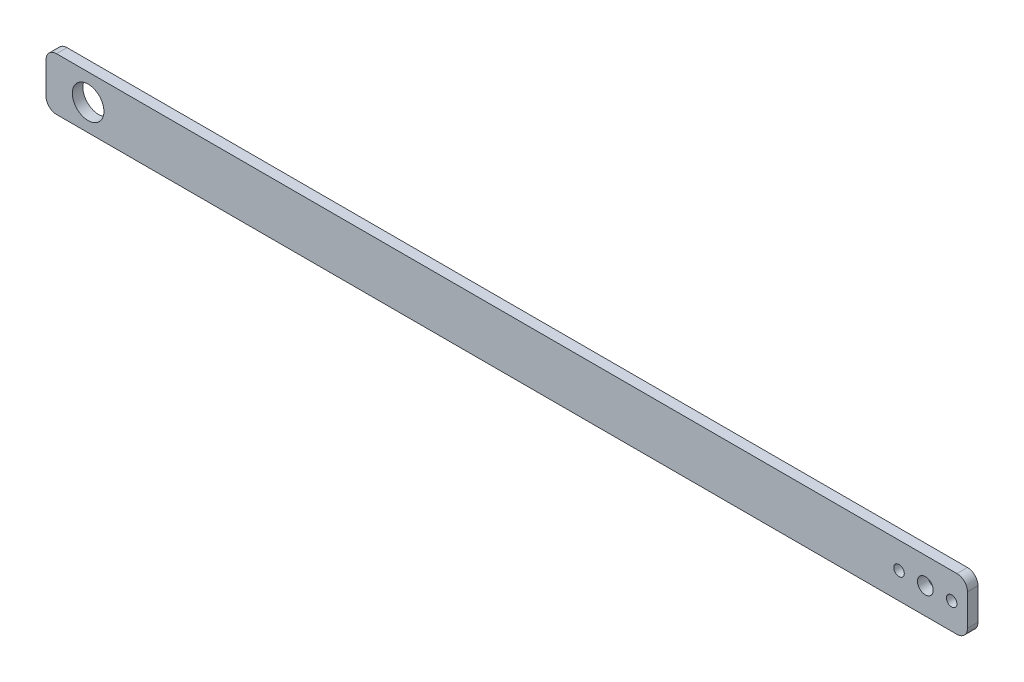
ISO-10303-21;
HEADER;
FILE_DESCRIPTION(('STEP AP214'),'2;1');
FILE_NAME('part.step','',(''),(''),'','','');
FILE_SCHEMA(('AUTOMOTIVE_DESIGN { 1 0 10303 214 1 1 1 1 }'));
ENDSEC;
DATA;
#1=APPLICATION_CONTEXT('core data for automotive mechanical design processes');
#2=APPLICATION_PROTOCOL_DEFINITION('international standard','automotive_design',2000,#1);
#3=PRODUCT_CONTEXT('',#1,'mechanical');
#4=PRODUCT('Part','Part','',(#3));
#5=PRODUCT_RELATED_PRODUCT_CATEGORY('part','',(#4));
#6=PRODUCT_DEFINITION_FORMATION('','',#4);
#7=PRODUCT_DEFINITION_CONTEXT('part definition',#1,'design');
#8=PRODUCT_DEFINITION('design','',#6,#7);
#9=PRODUCT_DEFINITION_SHAPE('','',#8);
#10=(LENGTH_UNIT() NAMED_UNIT(*) SI_UNIT(.MILLI.,.METRE.));
#11=(NAMED_UNIT(*) PLANE_ANGLE_UNIT() SI_UNIT($,.RADIAN.));
#12=(NAMED_UNIT(*) SI_UNIT($,.STERADIAN.) SOLID_ANGLE_UNIT());
#13=UNCERTAINTY_MEASURE_WITH_UNIT(LENGTH_MEASURE(1.E-05),#10,'distance_accuracy_value','');
#14=(GEOMETRIC_REPRESENTATION_CONTEXT(3) GLOBAL_UNCERTAINTY_ASSIGNED_CONTEXT((#13)) GLOBAL_UNIT_ASSIGNED_CONTEXT((#10,
#11,#12)) REPRESENTATION_CONTEXT('',''));
#15=CARTESIAN_POINT('',(0.,0.,0.));
#16=DIRECTION('',(0.,0.,1.));
#17=DIRECTION('',(1.,0.,0.));
#18=AXIS2_PLACEMENT_3D('',#15,#16,#17);
#19=CARTESIAN_POINT('',(-170.,-1.04083408558608E-13,2.));
#20=DIRECTION('',(1.,0.,0.));
#21=DIRECTION('',(0.,0.,-1.));
#22=AXIS2_PLACEMENT_3D('',#19,#20,#21);
#23=PLANE('',#22);
#24=DIRECTION('',(0.,-1.,0.));
#25=VECTOR('',#24,1.);
#26=CARTESIAN_POINT('',(-170.,-1.04083408558608E-13,0.));
#27=LINE('',#26,#25);
#28=CARTESIAN_POINT('',(-170.,-2.0000000000001,0.));
#29=VERTEX_POINT('',#28);
#30=CARTESIAN_POINT('',(-170.,-8.00000000000011,0.));
#31=VERTEX_POINT('',#30);
#32=EDGE_CURVE('E128',#29,#31,#27,.T.);
#33=ORIENTED_EDGE('',*,*,#32,.T.);
#34=DIRECTION('',(0.,0.,-1.));
#35=VECTOR('',#34,1.);
#36=CARTESIAN_POINT('',(-170.,-8.00000000000011,2.));
#37=LINE('',#36,#35);
#38=CARTESIAN_POINT('',(-170.,-8.00000000000011,2.));
#39=VERTEX_POINT('',#38);
#40=EDGE_CURVE('E106',#31,#39,#37,.F.);
#41=ORIENTED_EDGE('',*,*,#40,.T.);
#42=DIRECTION('',(0.,-1.,0.));
#43=VECTOR('',#42,1.);
#44=CARTESIAN_POINT('',(-170.,-1.04083408558608E-13,2.));
#45=LINE('',#44,#43);
#46=CARTESIAN_POINT('',(-170.,-2.0000000000001,2.));
#47=VERTEX_POINT('',#46);
#48=EDGE_CURVE('E138',#47,#39,#45,.T.);
#49=ORIENTED_EDGE('',*,*,#48,.F.);
#50=DIRECTION('',(0.,0.,-1.));
#51=VECTOR('',#50,1.);
#52=CARTESIAN_POINT('',(-170.,-2.0000000000001,2.));
#53=LINE('',#52,#51);
#54=EDGE_CURVE('E111',#47,#29,#53,.T.);
#55=ORIENTED_EDGE('',*,*,#54,.T.);
#56=EDGE_LOOP('',(#33,#41,#49,#55));
#57=FACE_BOUND('',#56,.T.);
#58=ADVANCED_FACE('F35',(#57),#23,.F.);
#59=CARTESIAN_POINT('',(-170.,-10.0000000000001,2.));
#60=DIRECTION('',(0.,1.,0.));
#61=DIRECTION('',(-1.,0.,0.));
#62=AXIS2_PLACEMENT_3D('',#59,#60,#61);
#63=PLANE('',#62);
#64=DIRECTION('',(1.,0.,0.));
#65=VECTOR('',#64,1.);
#66=CARTESIAN_POINT('',(-170.,-10.0000000000001,2.));
#67=LINE('',#66,#65);
#68=CARTESIAN_POINT('',(-168.,-10.0000000000001,2.));
#69=VERTEX_POINT('',#68);
#70=CARTESIAN_POINT('',(2.99999999999998,-10.0000000000001,2.));
#71=VERTEX_POINT('',#70);
#72=EDGE_CURVE('E121',#69,#71,#67,.T.);
#73=ORIENTED_EDGE('',*,*,#72,.F.);
#74=DIRECTION('',(0.,0.,-1.));
#75=VECTOR('',#74,1.);
#76=CARTESIAN_POINT('',(-168.,-10.0000000000001,2.));
#77=LINE('',#76,#75);
#78=CARTESIAN_POINT('',(-168.,-10.0000000000001,0.));
#79=VERTEX_POINT('',#78);
#80=EDGE_CURVE('E105',#69,#79,#77,.T.);
#81=ORIENTED_EDGE('',*,*,#80,.T.);
#82=DIRECTION('',(1.,0.,0.));
#83=VECTOR('',#82,1.);
#84=CARTESIAN_POINT('',(-170.,-10.0000000000001,0.));
#85=LINE('',#84,#83);
#86=CARTESIAN_POINT('',(2.99999999999998,-10.0000000000001,0.));
#87=VERTEX_POINT('',#86);
#88=EDGE_CURVE('E118',#79,#87,#85,.T.);
#89=ORIENTED_EDGE('',*,*,#88,.T.);
#90=DIRECTION('',(0.,0.,-1.));
#91=VECTOR('',#90,1.);
#92=CARTESIAN_POINT('',(2.99999999999998,-10.0000000000001,2.));
#93=LINE('',#92,#91);
#94=EDGE_CURVE('E123',#87,#71,#93,.F.);
#95=ORIENTED_EDGE('',*,*,#94,.T.);
#96=EDGE_LOOP('',(#73,#81,#89,#95));
#97=FACE_BOUND('',#96,.T.);
#98=ADVANCED_FACE('F117',(#97),#63,.F.);
#99=CARTESIAN_POINT('',(4.99999999999997,0.,2.));
#100=DIRECTION('',(-1.,0.,0.));
#101=DIRECTION('',(0.,-1.,0.));
#102=AXIS2_PLACEMENT_3D('',#99,#100,#101);
#103=PLANE('',#102);
#104=DIRECTION('',(0.,1.,0.));
#105=VECTOR('',#104,1.);
#106=CARTESIAN_POINT('',(4.99999999999997,0.,0.));
#107=LINE('',#106,#105);
#108=CARTESIAN_POINT('',(4.99999999999998,-8.00000000000005,0.));
#109=VERTEX_POINT('',#108);
#110=CARTESIAN_POINT('',(4.99999999999998,-2.00000000000005,0.));
#111=VERTEX_POINT('',#110);
#112=EDGE_CURVE('E127',#109,#111,#107,.T.);
#113=ORIENTED_EDGE('',*,*,#112,.T.);
#114=DIRECTION('',(0.,0.,-1.));
#115=VECTOR('',#114,1.);
#116=CARTESIAN_POINT('',(4.99999999999998,-2.00000000000005,2.));
#117=LINE('',#116,#115);
#118=CARTESIAN_POINT('',(4.99999999999998,-2.00000000000005,2.));
#119=VERTEX_POINT('',#118);
#120=EDGE_CURVE('E11',#111,#119,#117,.F.);
#121=ORIENTED_EDGE('',*,*,#120,.T.);
#122=DIRECTION('',(0.,1.,0.));
#123=VECTOR('',#122,1.);
#124=CARTESIAN_POINT('',(4.99999999999997,0.,2.));
#125=LINE('',#124,#123);
#126=CARTESIAN_POINT('',(4.99999999999998,-8.00000000000005,2.));
#127=VERTEX_POINT('',#126);
#128=EDGE_CURVE('E177',#127,#119,#125,.T.);
#129=ORIENTED_EDGE('',*,*,#128,.F.);
#130=DIRECTION('',(0.,0.,-1.));
#131=VECTOR('',#130,1.);
#132=CARTESIAN_POINT('',(4.99999999999998,-8.00000000000005,2.));
#133=LINE('',#132,#131);
#134=EDGE_CURVE('E43',#127,#109,#133,.T.);
#135=ORIENTED_EDGE('',*,*,#134,.T.);
#136=EDGE_LOOP('',(#113,#121,#129,#135));
#137=FACE_BOUND('',#136,.T.);
#138=ADVANCED_FACE('F175',(#137),#103,.F.);
#139=CARTESIAN_POINT('',(-170.,-1.04083408558608E-13,2.));
#140=DIRECTION('',(0.,-1.,0.));
#141=DIRECTION('',(1.,0.,0.));
#142=AXIS2_PLACEMENT_3D('',#139,#140,#141);
#143=PLANE('',#142);
#144=DIRECTION('',(-1.,0.,0.));
#145=VECTOR('',#144,1.);
#146=CARTESIAN_POINT('',(-170.,-1.04083408558608E-13,0.));
#147=LINE('',#146,#145);
#148=CARTESIAN_POINT('',(2.99999999999998,0.,0.));
#149=VERTEX_POINT('',#148);
#150=CARTESIAN_POINT('',(-168.,-1.03468820812834E-13,0.));
#151=VERTEX_POINT('',#150);
#152=EDGE_CURVE('E131',#149,#151,#147,.T.);
#153=ORIENTED_EDGE('',*,*,#152,.T.);
#154=DIRECTION('',(0.,0.,-1.));
#155=VECTOR('',#154,1.);
#156=CARTESIAN_POINT('',(-168.,-1.03468820812834E-13,2.));
#157=LINE('',#156,#155);
#158=CARTESIAN_POINT('',(-168.,-1.03468820812834E-13,2.));
#159=VERTEX_POINT('',#158);
#160=EDGE_CURVE('E50',#151,#159,#157,.F.);
#161=ORIENTED_EDGE('',*,*,#160,.T.);
#162=DIRECTION('',(-1.,0.,0.));
#163=VECTOR('',#162,1.);
#164=CARTESIAN_POINT('',(-170.,-1.04083408558608E-13,2.));
#165=LINE('',#164,#163);
#166=CARTESIAN_POINT('',(2.99999999999998,0.,2.));
#167=VERTEX_POINT('',#166);
#168=EDGE_CURVE('E152',#167,#159,#165,.T.);
#169=ORIENTED_EDGE('',*,*,#168,.F.);
#170=DIRECTION('',(0.,0.,-1.));
#171=VECTOR('',#170,1.);
#172=CARTESIAN_POINT('',(2.99999999999998,0.,2.));
#173=LINE('',#172,#171);
#174=EDGE_CURVE('E168',#167,#149,#173,.T.);
#175=ORIENTED_EDGE('',*,*,#174,.T.);
#176=EDGE_LOOP('',(#153,#161,#169,#175));
#177=FACE_BOUND('',#176,.T.);
#178=ADVANCED_FACE('F184',(#177),#143,.F.);
#179=CARTESIAN_POINT('',(0.,0.,2.));
#180=DIRECTION('',(0.,0.,1.));
#181=DIRECTION('',(1.,0.,0.));
#182=AXIS2_PLACEMENT_3D('',#179,#180,#181);
#183=PLANE('',#182);
#184=CARTESIAN_POINT('',(1.99999999999998,-5.00000000000006,2.));
#185=DIRECTION('',(0.,0.,1.));
#186=DIRECTION('',(1.,0.,0.));
#187=AXIS2_PLACEMENT_3D('',#184,#185,#186);
#188=CIRCLE('',#187,1.);
#189=CARTESIAN_POINT('',(2.99999999999998,-5.00000000000006,2.));
#190=VERTEX_POINT('',#189);
#191=EDGE_CURVE('E196',#190,#190,#188,.T.);
#192=ORIENTED_EDGE('',*,*,#191,.F.);
#193=EDGE_LOOP('',(#192));
#194=FACE_BOUND('',#193,.T.);
#195=CARTESIAN_POINT('',(-8.00000000000002,-5.00000000000006,2.));
#196=DIRECTION('',(0.,0.,1.));
#197=DIRECTION('',(1.,0.,0.));
#198=AXIS2_PLACEMENT_3D('',#195,#196,#197);
#199=CIRCLE('',#198,1.);
#200=CARTESIAN_POINT('',(-7.00000000000002,-5.00000000000006,2.));
#201=VERTEX_POINT('',#200);
#202=EDGE_CURVE('E195',#201,#201,#199,.T.);
#203=ORIENTED_EDGE('',*,*,#202,.F.);
#204=EDGE_LOOP('',(#203));
#205=FACE_BOUND('',#204,.T.);
#206=CARTESIAN_POINT('',(-3.00000000000002,-5.00000000000006,2.));
#207=DIRECTION('',(0.,0.,1.));
#208=DIRECTION('',(1.,0.,0.));
#209=AXIS2_PLACEMENT_3D('',#206,#207,#208);
#210=CIRCLE('',#209,1.5);
#211=CARTESIAN_POINT('',(-1.50000000000002,-5.00000000000006,2.));
#212=VERTEX_POINT('',#211);
#213=EDGE_CURVE('E147',#212,#212,#210,.T.);
#214=ORIENTED_EDGE('',*,*,#213,.F.);
#215=EDGE_LOOP('',(#214));
#216=FACE_BOUND('',#215,.T.);
#217=CARTESIAN_POINT('',(-162.,-5.0000000000001,2.));
#218=DIRECTION('',(0.,0.,1.));
#219=DIRECTION('',(1.,0.,0.));
#220=AXIS2_PLACEMENT_3D('',#217,#218,#219);
#221=CIRCLE('',#220,2.99999999999999);
#222=CARTESIAN_POINT('',(-159.,-5.0000000000001,2.));
#223=VERTEX_POINT('',#222);
#224=EDGE_CURVE('E133',#223,#223,#221,.F.);
#225=ORIENTED_EDGE('',*,*,#224,.T.);
#226=EDGE_LOOP('',(#225));
#227=FACE_BOUND('',#226,.T.);
#228=ORIENTED_EDGE('',*,*,#48,.T.);
#229=CARTESIAN_POINT('',(-168.,-8.00000000000011,2.));
#230=DIRECTION('',(0.,0.,1.));
#231=DIRECTION('',(1.,0.,0.));
#232=AXIS2_PLACEMENT_3D('',#229,#230,#231);
#233=CIRCLE('',#232,2.);
#234=EDGE_CURVE('E166',#39,#69,#233,.T.);
#235=ORIENTED_EDGE('',*,*,#234,.T.);
#236=ORIENTED_EDGE('',*,*,#72,.T.);
#237=CARTESIAN_POINT('',(2.99999999999998,-8.00000000000005,2.));
#238=DIRECTION('',(0.,0.,1.));
#239=DIRECTION('',(1.,0.,0.));
#240=AXIS2_PLACEMENT_3D('',#237,#238,#239);
#241=CIRCLE('',#240,2.);
#242=EDGE_CURVE('E161',#71,#127,#241,.T.);
#243=ORIENTED_EDGE('',*,*,#242,.T.);
#244=ORIENTED_EDGE('',*,*,#128,.T.);
#245=CARTESIAN_POINT('',(2.99999999999998,-2.00000000000005,2.));
#246=DIRECTION('',(0.,0.,1.));
#247=DIRECTION('',(1.,0.,0.));
#248=AXIS2_PLACEMENT_3D('',#245,#246,#247);
#249=CIRCLE('',#248,2.);
#250=EDGE_CURVE('E57',#119,#167,#249,.T.);
#251=ORIENTED_EDGE('',*,*,#250,.T.);
#252=ORIENTED_EDGE('',*,*,#168,.T.);
#253=CARTESIAN_POINT('',(-168.,-2.0000000000001,2.));
#254=DIRECTION('',(0.,0.,1.));
#255=DIRECTION('',(1.,0.,0.));
#256=AXIS2_PLACEMENT_3D('',#253,#254,#255);
#257=CIRCLE('',#256,2.);
#258=EDGE_CURVE('E164',#159,#47,#257,.T.);
#259=ORIENTED_EDGE('',*,*,#258,.T.);
#260=EDGE_LOOP('',(#228,#235,#236,#243,#244,#251,#252,#259));
#261=FACE_BOUND('',#260,.T.);
#262=ADVANCED_FACE('F205',(#194,#205,#216,#227,#261),#183,.T.);
#263=CARTESIAN_POINT('',(0.,0.,0.));
#264=DIRECTION('',(0.,0.,1.));
#265=DIRECTION('',(1.,0.,0.));
#266=AXIS2_PLACEMENT_3D('',#263,#264,#265);
#267=PLANE('',#266);
#268=CARTESIAN_POINT('',(1.99999999999998,-5.00000000000006,0.));
#269=DIRECTION('',(0.,0.,1.));
#270=DIRECTION('',(1.,0.,0.));
#271=AXIS2_PLACEMENT_3D('',#268,#269,#270);
#272=CIRCLE('',#271,1.);
#273=CARTESIAN_POINT('',(2.99999999999998,-5.00000000000006,0.));
#274=VERTEX_POINT('',#273);
#275=EDGE_CURVE('E142',#274,#274,#272,.T.);
#276=ORIENTED_EDGE('',*,*,#275,.T.);
#277=EDGE_LOOP('',(#276));
#278=FACE_BOUND('',#277,.T.);
#279=CARTESIAN_POINT('',(-8.00000000000002,-5.00000000000006,0.));
#280=DIRECTION('',(0.,0.,1.));
#281=DIRECTION('',(1.,0.,0.));
#282=AXIS2_PLACEMENT_3D('',#279,#280,#281);
#283=CIRCLE('',#282,1.);
#284=CARTESIAN_POINT('',(-7.00000000000002,-5.00000000000006,0.));
#285=VERTEX_POINT('',#284);
#286=EDGE_CURVE('E146',#285,#285,#283,.T.);
#287=ORIENTED_EDGE('',*,*,#286,.T.);
#288=EDGE_LOOP('',(#287));
#289=FACE_BOUND('',#288,.T.);
#290=CARTESIAN_POINT('',(-3.00000000000002,-5.00000000000006,0.));
#291=DIRECTION('',(0.,0.,1.));
#292=DIRECTION('',(1.,0.,0.));
#293=AXIS2_PLACEMENT_3D('',#290,#291,#292);
#294=CIRCLE('',#293,1.5);
#295=CARTESIAN_POINT('',(-1.50000000000002,-5.00000000000006,0.));
#296=VERTEX_POINT('',#295);
#297=EDGE_CURVE('E143',#296,#296,#294,.T.);
#298=ORIENTED_EDGE('',*,*,#297,.T.);
#299=EDGE_LOOP('',(#298));
#300=FACE_BOUND('',#299,.T.);
#301=CARTESIAN_POINT('',(-162.,-5.0000000000001,0.));
#302=DIRECTION('',(0.,0.,1.));
#303=DIRECTION('',(1.,0.,0.));
#304=AXIS2_PLACEMENT_3D('',#301,#302,#303);
#305=CIRCLE('',#304,2.99999999999999);
#306=CARTESIAN_POINT('',(-159.,-5.0000000000001,0.));
#307=VERTEX_POINT('',#306);
#308=EDGE_CURVE('E139',#307,#307,#305,.F.);
#309=ORIENTED_EDGE('',*,*,#308,.F.);
#310=EDGE_LOOP('',(#309));
#311=FACE_BOUND('',#310,.T.);
#312=ORIENTED_EDGE('',*,*,#88,.F.);
#313=CARTESIAN_POINT('',(-168.,-8.00000000000011,0.));
#314=DIRECTION('',(0.,0.,1.));
#315=DIRECTION('',(1.,0.,0.));
#316=AXIS2_PLACEMENT_3D('',#313,#314,#315);
#317=CIRCLE('',#316,2.);
#318=EDGE_CURVE('E101',#79,#31,#317,.F.);
#319=ORIENTED_EDGE('',*,*,#318,.T.);
#320=ORIENTED_EDGE('',*,*,#32,.F.);
#321=CARTESIAN_POINT('',(-168.,-2.0000000000001,0.));
#322=DIRECTION('',(0.,0.,1.));
#323=DIRECTION('',(1.,0.,0.));
#324=AXIS2_PLACEMENT_3D('',#321,#322,#323);
#325=CIRCLE('',#324,2.);
#326=EDGE_CURVE('E112',#29,#151,#325,.F.);
#327=ORIENTED_EDGE('',*,*,#326,.T.);
#328=ORIENTED_EDGE('',*,*,#152,.F.);
#329=CARTESIAN_POINT('',(2.99999999999998,-2.00000000000005,0.));
#330=DIRECTION('',(0.,0.,1.));
#331=DIRECTION('',(1.,0.,0.));
#332=AXIS2_PLACEMENT_3D('',#329,#330,#331);
#333=CIRCLE('',#332,2.);
#334=EDGE_CURVE('E155',#149,#111,#333,.F.);
#335=ORIENTED_EDGE('',*,*,#334,.T.);
#336=ORIENTED_EDGE('',*,*,#112,.F.);
#337=CARTESIAN_POINT('',(2.99999999999998,-8.00000000000005,0.));
#338=DIRECTION('',(0.,0.,1.));
#339=DIRECTION('',(1.,0.,0.));
#340=AXIS2_PLACEMENT_3D('',#337,#338,#339);
#341=CIRCLE('',#340,2.);
#342=EDGE_CURVE('E122',#109,#87,#341,.F.);
#343=ORIENTED_EDGE('',*,*,#342,.T.);
#344=EDGE_LOOP('',(#312,#319,#320,#327,#328,#335,#336,#343));
#345=FACE_BOUND('',#344,.T.);
#346=ADVANCED_FACE('F125',(#278,#289,#300,#311,#345),#267,.F.);
#347=CARTESIAN_POINT('',(-162.,-5.0000000000001,14.));
#348=DIRECTION('',(0.,0.,-1.));
#349=DIRECTION('',(-1.,0.,0.));
#350=AXIS2_PLACEMENT_3D('',#347,#348,#349);
#351=CYLINDRICAL_SURFACE('',#350,2.99999999999999);
#352=ORIENTED_EDGE('',*,*,#224,.F.);
#353=EDGE_LOOP('',(#352));
#354=FACE_BOUND('',#353,.T.);
#355=ORIENTED_EDGE('',*,*,#308,.T.);
#356=EDGE_LOOP('',(#355));
#357=FACE_BOUND('',#356,.T.);
#358=ADVANCED_FACE('F238',(#354,#357),#351,.F.);
#359=CARTESIAN_POINT('',(-3.00000000000002,-5.00000000000006,-8.));
#360=DIRECTION('',(0.,0.,1.));
#361=DIRECTION('',(1.,0.,0.));
#362=AXIS2_PLACEMENT_3D('',#359,#360,#361);
#363=CYLINDRICAL_SURFACE('',#362,1.5);
#364=ORIENTED_EDGE('',*,*,#213,.T.);
#365=EDGE_LOOP('',(#364));
#366=FACE_BOUND('',#365,.T.);
#367=ORIENTED_EDGE('',*,*,#297,.F.);
#368=EDGE_LOOP('',(#367));
#369=FACE_BOUND('',#368,.T.);
#370=ADVANCED_FACE('F243',(#366,#369),#363,.F.);
#371=CARTESIAN_POINT('',(-8.00000000000002,-5.00000000000006,-8.));
#372=DIRECTION('',(0.,0.,1.));
#373=DIRECTION('',(1.,0.,0.));
#374=AXIS2_PLACEMENT_3D('',#371,#372,#373);
#375=CYLINDRICAL_SURFACE('',#374,1.);
#376=ORIENTED_EDGE('',*,*,#202,.T.);
#377=EDGE_LOOP('',(#376));
#378=FACE_BOUND('',#377,.T.);
#379=ORIENTED_EDGE('',*,*,#286,.F.);
#380=EDGE_LOOP('',(#379));
#381=FACE_BOUND('',#380,.T.);
#382=ADVANCED_FACE('F202',(#378,#381),#375,.F.);
#383=CARTESIAN_POINT('',(1.99999999999998,-5.00000000000006,-8.));
#384=DIRECTION('',(0.,0.,1.));
#385=DIRECTION('',(1.,0.,0.));
#386=AXIS2_PLACEMENT_3D('',#383,#384,#385);
#387=CYLINDRICAL_SURFACE('',#386,1.);
#388=ORIENTED_EDGE('',*,*,#191,.T.);
#389=EDGE_LOOP('',(#388));
#390=FACE_BOUND('',#389,.T.);
#391=ORIENTED_EDGE('',*,*,#275,.F.);
#392=EDGE_LOOP('',(#391));
#393=FACE_BOUND('',#392,.T.);
#394=ADVANCED_FACE('F224',(#390,#393),#387,.F.);
#395=CARTESIAN_POINT('',(-168.,-8.00000000000011,2.));
#396=DIRECTION('',(0.,0.,-1.));
#397=DIRECTION('',(-1.,0.,0.));
#398=AXIS2_PLACEMENT_3D('',#395,#396,#397);
#399=CYLINDRICAL_SURFACE('',#398,2.);
#400=ORIENTED_EDGE('',*,*,#234,.F.);
#401=ORIENTED_EDGE('',*,*,#40,.F.);
#402=ORIENTED_EDGE('',*,*,#318,.F.);
#403=ORIENTED_EDGE('',*,*,#80,.F.);
#404=EDGE_LOOP('',(#400,#401,#402,#403));
#405=FACE_BOUND('',#404,.T.);
#406=ADVANCED_FACE('F104',(#405),#399,.T.);
#407=CARTESIAN_POINT('',(-168.,-2.0000000000001,2.));
#408=DIRECTION('',(0.,0.,-1.));
#409=DIRECTION('',(-1.,0.,0.));
#410=AXIS2_PLACEMENT_3D('',#407,#408,#409);
#411=CYLINDRICAL_SURFACE('',#410,2.);
#412=ORIENTED_EDGE('',*,*,#258,.F.);
#413=ORIENTED_EDGE('',*,*,#160,.F.);
#414=ORIENTED_EDGE('',*,*,#326,.F.);
#415=ORIENTED_EDGE('',*,*,#54,.F.);
#416=EDGE_LOOP('',(#412,#413,#414,#415));
#417=FACE_BOUND('',#416,.T.);
#418=ADVANCED_FACE('F217',(#417),#411,.T.);
#419=CARTESIAN_POINT('',(2.99999999999998,-2.00000000000005,2.));
#420=DIRECTION('',(0.,0.,-1.));
#421=DIRECTION('',(-1.,0.,0.));
#422=AXIS2_PLACEMENT_3D('',#419,#420,#421);
#423=CYLINDRICAL_SURFACE('',#422,2.);
#424=ORIENTED_EDGE('',*,*,#250,.F.);
#425=ORIENTED_EDGE('',*,*,#120,.F.);
#426=ORIENTED_EDGE('',*,*,#334,.F.);
#427=ORIENTED_EDGE('',*,*,#174,.F.);
#428=EDGE_LOOP('',(#424,#425,#426,#427));
#429=FACE_BOUND('',#428,.T.);
#430=ADVANCED_FACE('F183',(#429),#423,.T.);
#431=CARTESIAN_POINT('',(2.99999999999998,-8.00000000000005,2.));
#432=DIRECTION('',(0.,0.,-1.));
#433=DIRECTION('',(-1.,0.,0.));
#434=AXIS2_PLACEMENT_3D('',#431,#432,#433);
#435=CYLINDRICAL_SURFACE('',#434,2.);
#436=ORIENTED_EDGE('',*,*,#242,.F.);
#437=ORIENTED_EDGE('',*,*,#94,.F.);
#438=ORIENTED_EDGE('',*,*,#342,.F.);
#439=ORIENTED_EDGE('',*,*,#134,.F.);
#440=EDGE_LOOP('',(#436,#437,#438,#439));
#441=FACE_BOUND('',#440,.T.);
#442=ADVANCED_FACE('F37',(#441),#435,.T.);
#443=CLOSED_SHELL('',(#58,#98,#138,#178,#262,#346,#358,#370,#382,#394,#406,#418,#430,#442));
#444=MANIFOLD_SOLID_BREP('B2',#443);
#445=ADVANCED_BREP_SHAPE_REPRESENTATION('',(#18,#444),#14);
#446=SHAPE_DEFINITION_REPRESENTATION(#9,#445);
ENDSEC;
END-ISO-10303-21;
